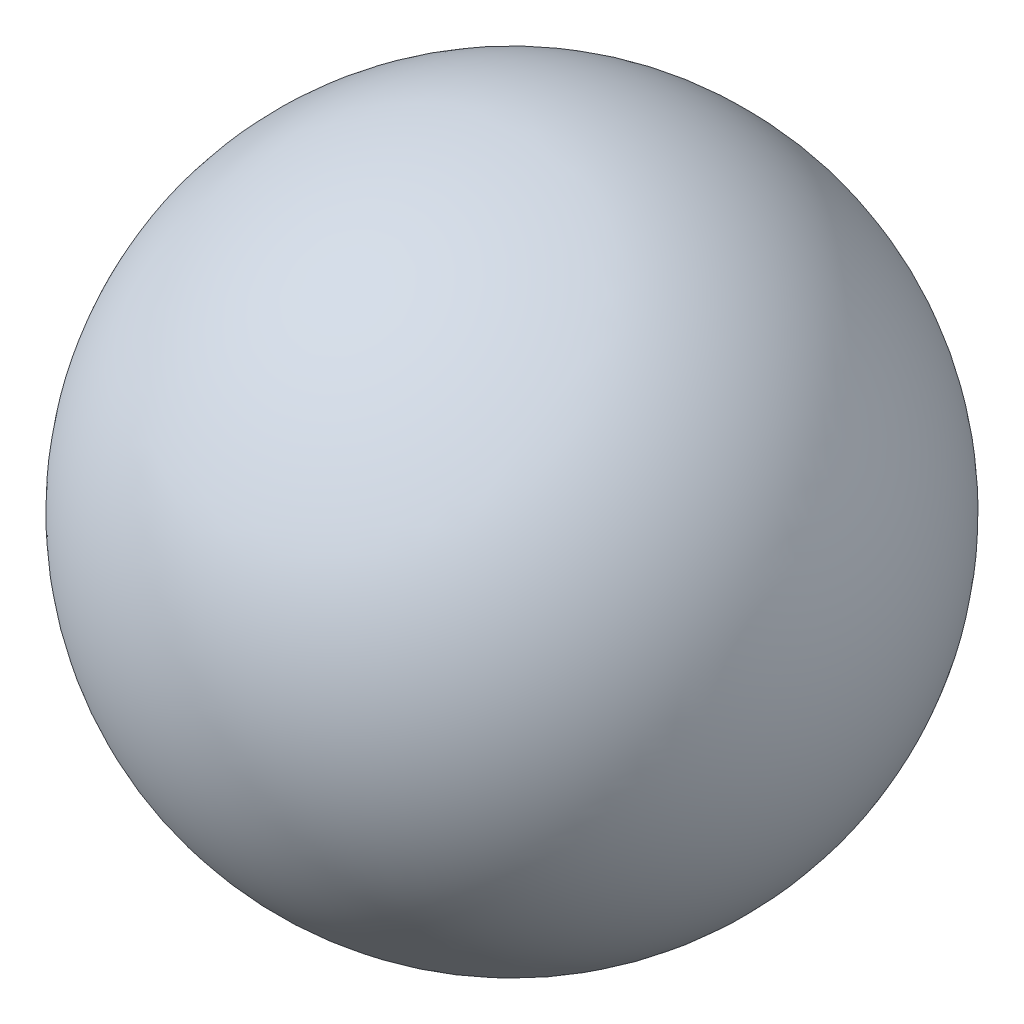
ISO-10303-21;
HEADER;
FILE_DESCRIPTION(('STEP AP214'),'2;1');
FILE_NAME('part.step','',(''),(''),'','','');
FILE_SCHEMA(('AUTOMOTIVE_DESIGN { 1 0 10303 214 1 1 1 1 }'));
ENDSEC;
DATA;
#1=APPLICATION_CONTEXT('core data for automotive mechanical design processes');
#2=APPLICATION_PROTOCOL_DEFINITION('international standard','automotive_design',2000,#1);
#3=PRODUCT_CONTEXT('',#1,'mechanical');
#4=PRODUCT('Part','Part','',(#3));
#5=PRODUCT_RELATED_PRODUCT_CATEGORY('part','',(#4));
#6=PRODUCT_DEFINITION_FORMATION('','',#4);
#7=PRODUCT_DEFINITION_CONTEXT('part definition',#1,'design');
#8=PRODUCT_DEFINITION('design','',#6,#7);
#9=PRODUCT_DEFINITION_SHAPE('','',#8);
#10=(LENGTH_UNIT() NAMED_UNIT(*) SI_UNIT(.MILLI.,.METRE.));
#11=(NAMED_UNIT(*) PLANE_ANGLE_UNIT() SI_UNIT($,.RADIAN.));
#12=(NAMED_UNIT(*) SI_UNIT($,.STERADIAN.) SOLID_ANGLE_UNIT());
#13=UNCERTAINTY_MEASURE_WITH_UNIT(LENGTH_MEASURE(1.E-05),#10,'distance_accuracy_value','');
#14=(GEOMETRIC_REPRESENTATION_CONTEXT(3) GLOBAL_UNCERTAINTY_ASSIGNED_CONTEXT((#13)) GLOBAL_UNIT_ASSIGNED_CONTEXT((#10,
#11,#12)) REPRESENTATION_CONTEXT('',''));
#15=CARTESIAN_POINT('',(0.,0.,0.));
#16=DIRECTION('',(0.,0.,1.));
#17=DIRECTION('',(1.,0.,0.));
#18=AXIS2_PLACEMENT_3D('',#15,#16,#17);
#19=CARTESIAN_POINT('',(0.,0.,0.));
#20=DIRECTION('',(-1.,0.,0.));
#21=DIRECTION('',(0.,1.,0.));
#22=AXIS2_PLACEMENT_3D('',#19,#20,#21);
#23=SPHERICAL_SURFACE('',#22,139.7);
#24=CARTESIAN_POINT('',(-139.7,0.,0.));
#25=VERTEX_POINT('',#24);
#26=VERTEX_LOOP('',#25);
#27=FACE_BOUND('',#26,.T.);
#28=ADVANCED_FACE('F29',(#27),#23,.T.);
#29=CLOSED_SHELL('',(#28));
#30=MANIFOLD_SOLID_BREP('B2',#29);
#31=ADVANCED_BREP_SHAPE_REPRESENTATION('',(#18,#30),#14);
#32=SHAPE_DEFINITION_REPRESENTATION(#9,#31);
ENDSEC;
END-ISO-10303-21;
